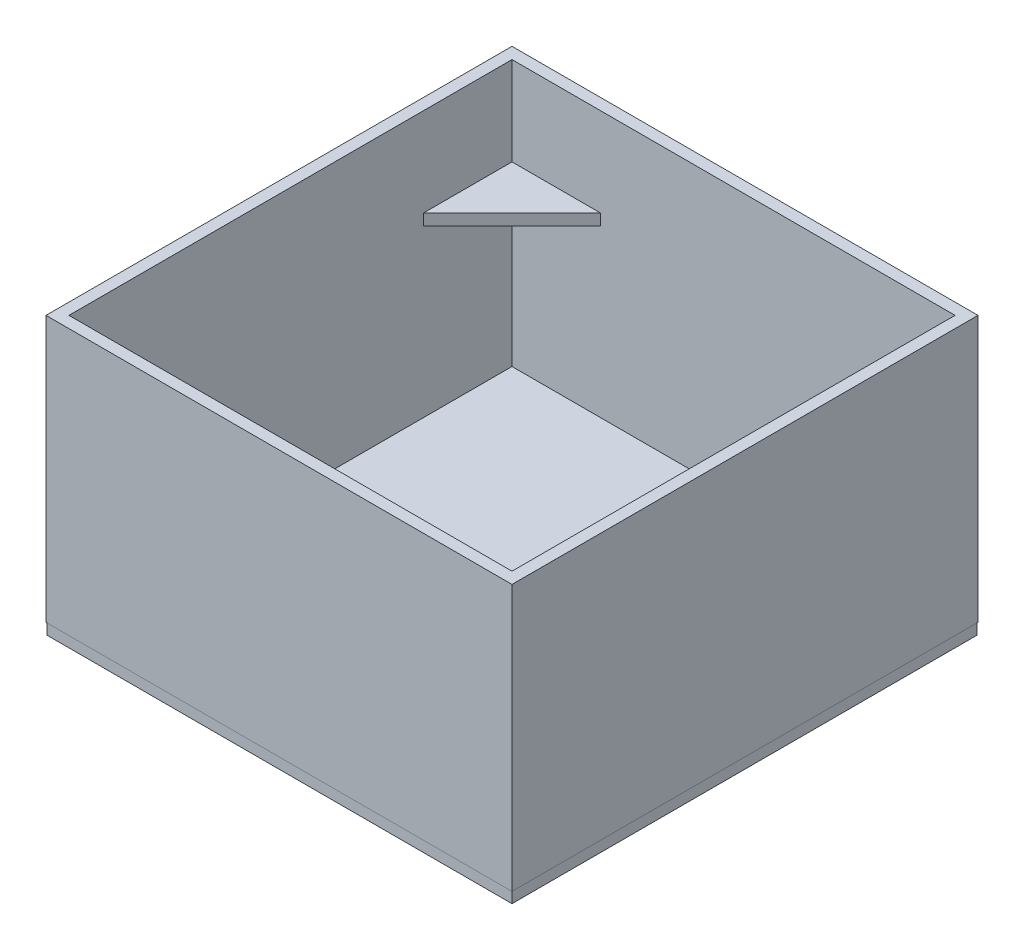
ISO-10303-21;
HEADER;
FILE_DESCRIPTION(('STEP AP214'),'2;1');
FILE_NAME('part.step','',(''),(''),'','','');
FILE_SCHEMA(('AUTOMOTIVE_DESIGN { 1 0 10303 214 1 1 1 1 }'));
ENDSEC;
DATA;
#1=APPLICATION_CONTEXT('core data for automotive mechanical design processes');
#2=APPLICATION_PROTOCOL_DEFINITION('international standard','automotive_design',2000,#1);
#3=PRODUCT_CONTEXT('',#1,'mechanical');
#4=PRODUCT('Part','Part','',(#3));
#5=PRODUCT_RELATED_PRODUCT_CATEGORY('part','',(#4));
#6=PRODUCT_DEFINITION_FORMATION('','',#4);
#7=PRODUCT_DEFINITION_CONTEXT('part definition',#1,'design');
#8=PRODUCT_DEFINITION('design','',#6,#7);
#9=PRODUCT_DEFINITION_SHAPE('','',#8);
#10=(LENGTH_UNIT() NAMED_UNIT(*) SI_UNIT(.MILLI.,.METRE.));
#11=(NAMED_UNIT(*) PLANE_ANGLE_UNIT() SI_UNIT($,.RADIAN.));
#12=(NAMED_UNIT(*) SI_UNIT($,.STERADIAN.) SOLID_ANGLE_UNIT());
#13=UNCERTAINTY_MEASURE_WITH_UNIT(LENGTH_MEASURE(1.E-05),#10,'distance_accuracy_value','');
#14=(GEOMETRIC_REPRESENTATION_CONTEXT(3) GLOBAL_UNCERTAINTY_ASSIGNED_CONTEXT((#13)) GLOBAL_UNIT_ASSIGNED_CONTEXT((#10,
#11,#12)) REPRESENTATION_CONTEXT('',''));
#15=CARTESIAN_POINT('',(0.,0.,0.));
#16=DIRECTION('',(0.,0.,1.));
#17=DIRECTION('',(1.,0.,0.));
#18=AXIS2_PLACEMENT_3D('',#15,#16,#17);
#19=CARTESIAN_POINT('',(52.9092657342657,79.375,-74.0019230769231));
#20=DIRECTION('',(1.,0.,0.));
#21=DIRECTION('',(0.,0.,-1.));
#22=AXIS2_PLACEMENT_3D('',#19,#20,#21);
#23=PLANE('',#22);
#24=DIRECTION('',(0.,0.,-1.));
#25=VECTOR('',#24,1.);
#26=CARTESIAN_POINT('',(52.9092657342657,50.8,52.9980769230769));
#27=LINE('',#26,#25);
#28=CARTESIAN_POINT('',(52.9092657342657,50.8,52.9980769230769));
#29=VERTEX_POINT('',#28);
#30=CARTESIAN_POINT('',(52.9092657342657,50.8,27.5980769230769));
#31=VERTEX_POINT('',#30);
#32=EDGE_CURVE('E219',#29,#31,#27,.T.);
#33=ORIENTED_EDGE('',*,*,#32,.T.);
#34=DIRECTION('',(0.,1.,0.));
#35=VECTOR('',#34,1.);
#36=CARTESIAN_POINT('',(52.9092657342657,50.8,27.5980769230769));
#37=LINE('',#36,#35);
#38=CARTESIAN_POINT('',(52.9092657342657,53.975,27.5980769230769));
#39=VERTEX_POINT('',#38);
#40=EDGE_CURVE('E559',#31,#39,#37,.T.);
#41=ORIENTED_EDGE('',*,*,#40,.T.);
#42=DIRECTION('',(0.,0.,-1.));
#43=VECTOR('',#42,1.);
#44=CARTESIAN_POINT('',(52.9092657342657,53.975,52.9980769230769));
#45=LINE('',#44,#43);
#46=CARTESIAN_POINT('',(52.9092657342657,53.975,52.9980769230769));
#47=VERTEX_POINT('',#46);
#48=EDGE_CURVE('E554',#47,#39,#45,.T.);
#49=ORIENTED_EDGE('',*,*,#48,.F.);
#50=DIRECTION('',(0.,-1.,0.));
#51=VECTOR('',#50,1.);
#52=CARTESIAN_POINT('',(52.9092657342657,79.375,52.9980769230769));
#53=LINE('',#52,#51);
#54=CARTESIAN_POINT('',(52.9092657342657,79.375,52.9980769230769));
#55=VERTEX_POINT('',#54);
#56=EDGE_CURVE('E241',#55,#47,#53,.T.);
#57=ORIENTED_EDGE('',*,*,#56,.F.);
#58=DIRECTION('',(0.,0.,1.));
#59=VECTOR('',#58,1.);
#60=CARTESIAN_POINT('',(52.9092657342657,79.375,-74.0019230769231));
#61=LINE('',#60,#59);
#62=CARTESIAN_POINT('',(52.9092657342657,79.375,-74.0019230769231));
#63=VERTEX_POINT('',#62);
#64=EDGE_CURVE('E568',#63,#55,#61,.T.);
#65=ORIENTED_EDGE('',*,*,#64,.F.);
#66=DIRECTION('',(0.,-1.,0.));
#67=VECTOR('',#66,1.);
#68=CARTESIAN_POINT('',(52.9092657342657,79.375,-74.0019230769231));
#69=LINE('',#68,#67);
#70=CARTESIAN_POINT('',(52.9092657342657,53.975,-74.0019230769231));
#71=VERTEX_POINT('',#70);
#72=EDGE_CURVE('E242',#63,#71,#69,.T.);
#73=ORIENTED_EDGE('',*,*,#72,.T.);
#74=DIRECTION('',(0.,0.,-1.));
#75=VECTOR('',#74,1.);
#76=CARTESIAN_POINT('',(52.9092657342657,53.975,-48.6019230769231));
#77=LINE('',#76,#75);
#78=CARTESIAN_POINT('',(52.9092657342657,53.975,-48.6019230769231));
#79=VERTEX_POINT('',#78);
#80=EDGE_CURVE('E619',#79,#71,#77,.T.);
#81=ORIENTED_EDGE('',*,*,#80,.F.);
#82=DIRECTION('',(0.,1.,0.));
#83=VECTOR('',#82,1.);
#84=CARTESIAN_POINT('',(52.9092657342657,50.8,-48.6019230769231));
#85=LINE('',#84,#83);
#86=CARTESIAN_POINT('',(52.9092657342657,50.8,-48.6019230769231));
#87=VERTEX_POINT('',#86);
#88=EDGE_CURVE('E606',#87,#79,#85,.T.);
#89=ORIENTED_EDGE('',*,*,#88,.F.);
#90=DIRECTION('',(0.,0.,-1.));
#91=VECTOR('',#90,1.);
#92=CARTESIAN_POINT('',(52.9092657342657,50.8,-48.6019230769231));
#93=LINE('',#92,#91);
#94=CARTESIAN_POINT('',(52.9092657342657,50.8,-74.0019230769231));
#95=VERTEX_POINT('',#94);
#96=EDGE_CURVE('E604',#87,#95,#93,.T.);
#97=ORIENTED_EDGE('',*,*,#96,.T.);
#98=CARTESIAN_POINT('',(52.9092657342657,3.175,-74.0019230769231));
#99=VERTEX_POINT('',#98);
#100=EDGE_CURVE('E247',#95,#99,#69,.T.);
#101=ORIENTED_EDGE('',*,*,#100,.T.);
#102=DIRECTION('',(0.,0.,1.));
#103=VECTOR('',#102,1.);
#104=CARTESIAN_POINT('',(52.9092657342657,3.175,-74.0019230769231));
#105=LINE('',#104,#103);
#106=CARTESIAN_POINT('',(52.9092657342657,3.175,52.9980769230769));
#107=VERTEX_POINT('',#106);
#108=EDGE_CURVE('E240',#99,#107,#105,.T.);
#109=ORIENTED_EDGE('',*,*,#108,.T.);
#110=EDGE_CURVE('E233',#29,#107,#53,.T.);
#111=ORIENTED_EDGE('',*,*,#110,.F.);
#112=EDGE_LOOP('',(#33,#41,#49,#57,#65,#73,#81,#89,#97,#101,#109,#111));
#113=FACE_BOUND('',#112,.T.);
#114=ADVANCED_FACE('F57',(#113),#23,.F.);
#115=CARTESIAN_POINT('',(52.9092657342657,79.375,52.9980769230769));
#116=DIRECTION('',(0.,0.,1.));
#117=DIRECTION('',(1.,0.,0.));
#118=AXIS2_PLACEMENT_3D('',#115,#116,#117);
#119=PLANE('',#118);
#120=DIRECTION('',(1.,0.,0.));
#121=VECTOR('',#120,1.);
#122=CARTESIAN_POINT('',(27.5092657342657,50.8,52.9980769230769));
#123=LINE('',#122,#121);
#124=CARTESIAN_POINT('',(27.5092657342657,50.8,52.9980769230769));
#125=VERTEX_POINT('',#124);
#126=EDGE_CURVE('E222',#125,#29,#123,.T.);
#127=ORIENTED_EDGE('',*,*,#126,.T.);
#128=ORIENTED_EDGE('',*,*,#110,.T.);
#129=DIRECTION('',(-1.,0.,0.));
#130=VECTOR('',#129,1.);
#131=CARTESIAN_POINT('',(52.9092657342657,3.175,52.9980769230769));
#132=LINE('',#131,#130);
#133=CARTESIAN_POINT('',(-74.0907342657343,3.175,52.9980769230769));
#134=VERTEX_POINT('',#133);
#135=EDGE_CURVE('E580',#107,#134,#132,.T.);
#136=ORIENTED_EDGE('',*,*,#135,.T.);
#137=DIRECTION('',(0.,-1.,0.));
#138=VECTOR('',#137,1.);
#139=CARTESIAN_POINT('',(-74.0907342657343,79.375,52.9980769230769));
#140=LINE('',#139,#138);
#141=CARTESIAN_POINT('',(-74.0907342657343,50.8,52.9980769230769));
#142=VERTEX_POINT('',#141);
#143=EDGE_CURVE('E245',#142,#134,#140,.T.);
#144=ORIENTED_EDGE('',*,*,#143,.F.);
#145=DIRECTION('',(1.,0.,0.));
#146=VECTOR('',#145,1.);
#147=CARTESIAN_POINT('',(-74.0907342657343,50.8,52.9980769230769));
#148=LINE('',#147,#146);
#149=CARTESIAN_POINT('',(-48.6907342657343,50.8,52.9980769230769));
#150=VERTEX_POINT('',#149);
#151=EDGE_CURVE('E625',#142,#150,#148,.T.);
#152=ORIENTED_EDGE('',*,*,#151,.T.);
#153=DIRECTION('',(0.,1.,0.));
#154=VECTOR('',#153,1.);
#155=CARTESIAN_POINT('',(-48.6907342657343,50.8,52.9980769230769));
#156=LINE('',#155,#154);
#157=CARTESIAN_POINT('',(-48.6907342657343,53.975,52.9980769230769));
#158=VERTEX_POINT('',#157);
#159=EDGE_CURVE('E631',#150,#158,#156,.T.);
#160=ORIENTED_EDGE('',*,*,#159,.T.);
#161=DIRECTION('',(1.,0.,0.));
#162=VECTOR('',#161,1.);
#163=CARTESIAN_POINT('',(-74.0907342657343,53.975,52.9980769230769));
#164=LINE('',#163,#162);
#165=CARTESIAN_POINT('',(-74.0907342657343,53.975,52.9980769230769));
#166=VERTEX_POINT('',#165);
#167=EDGE_CURVE('E623',#166,#158,#164,.T.);
#168=ORIENTED_EDGE('',*,*,#167,.F.);
#169=CARTESIAN_POINT('',(-74.0907342657343,79.375,52.9980769230769));
#170=VERTEX_POINT('',#169);
#171=EDGE_CURVE('E250',#170,#166,#140,.T.);
#172=ORIENTED_EDGE('',*,*,#171,.F.);
#173=DIRECTION('',(-1.,0.,0.));
#174=VECTOR('',#173,1.);
#175=CARTESIAN_POINT('',(52.9092657342657,79.375,52.9980769230769));
#176=LINE('',#175,#174);
#177=EDGE_CURVE('E563',#55,#170,#176,.T.);
#178=ORIENTED_EDGE('',*,*,#177,.F.);
#179=ORIENTED_EDGE('',*,*,#56,.T.);
#180=DIRECTION('',(1.,0.,0.));
#181=VECTOR('',#180,1.);
#182=CARTESIAN_POINT('',(27.5092657342657,53.975,52.9980769230769));
#183=LINE('',#182,#181);
#184=CARTESIAN_POINT('',(27.5092657342657,53.975,52.9980769230769));
#185=VERTEX_POINT('',#184);
#186=EDGE_CURVE('E552',#185,#47,#183,.T.);
#187=ORIENTED_EDGE('',*,*,#186,.F.);
#188=DIRECTION('',(0.,1.,0.));
#189=VECTOR('',#188,1.);
#190=CARTESIAN_POINT('',(27.5092657342657,50.8,52.9980769230769));
#191=LINE('',#190,#189);
#192=EDGE_CURVE('E236',#125,#185,#191,.T.);
#193=ORIENTED_EDGE('',*,*,#192,.F.);
#194=EDGE_LOOP('',(#127,#128,#136,#144,#152,#160,#168,#172,#178,#179,#187,#193));
#195=FACE_BOUND('',#194,.T.);
#196=ADVANCED_FACE('F231',(#195),#119,.F.);
#197=CARTESIAN_POINT('',(-74.0907342657343,79.375,-74.0019230769231));
#198=DIRECTION('',(0.,0.,-1.));
#199=DIRECTION('',(-1.,0.,0.));
#200=AXIS2_PLACEMENT_3D('',#197,#198,#199);
#201=PLANE('',#200);
#202=DIRECTION('',(-1.,0.,0.));
#203=VECTOR('',#202,1.);
#204=CARTESIAN_POINT('',(52.9092657342657,50.8,-74.0019230769231));
#205=LINE('',#204,#203);
#206=CARTESIAN_POINT('',(27.5092657342657,50.8,-74.0019230769231));
#207=VERTEX_POINT('',#206);
#208=EDGE_CURVE('E601',#95,#207,#205,.T.);
#209=ORIENTED_EDGE('',*,*,#208,.T.);
#210=DIRECTION('',(0.,1.,0.));
#211=VECTOR('',#210,1.);
#212=CARTESIAN_POINT('',(27.5092657342657,50.8,-74.0019230769231));
#213=LINE('',#212,#211);
#214=CARTESIAN_POINT('',(27.5092657342657,53.975,-74.0019230769231));
#215=VERTEX_POINT('',#214);
#216=EDGE_CURVE('E618',#207,#215,#213,.T.);
#217=ORIENTED_EDGE('',*,*,#216,.T.);
#218=DIRECTION('',(-1.,0.,0.));
#219=VECTOR('',#218,1.);
#220=CARTESIAN_POINT('',(52.9092657342657,53.975,-74.0019230769231));
#221=LINE('',#220,#219);
#222=EDGE_CURVE('E612',#71,#215,#221,.T.);
#223=ORIENTED_EDGE('',*,*,#222,.F.);
#224=ORIENTED_EDGE('',*,*,#72,.F.);
#225=DIRECTION('',(1.,0.,0.));
#226=VECTOR('',#225,1.);
#227=CARTESIAN_POINT('',(-74.0907342657343,79.375,-74.0019230769231));
#228=LINE('',#227,#226);
#229=CARTESIAN_POINT('',(-74.0907342657343,79.375,-74.0019230769231));
#230=VERTEX_POINT('',#229);
#231=EDGE_CURVE('E571',#230,#63,#228,.T.);
#232=ORIENTED_EDGE('',*,*,#231,.F.);
#233=DIRECTION('',(0.,-1.,0.));
#234=VECTOR('',#233,1.);
#235=CARTESIAN_POINT('',(-74.0907342657343,79.375,-74.0019230769231));
#236=LINE('',#235,#234);
#237=CARTESIAN_POINT('',(-74.0907342657343,53.975,-74.0019230769231));
#238=VERTEX_POINT('',#237);
#239=EDGE_CURVE('E270',#230,#238,#236,.T.);
#240=ORIENTED_EDGE('',*,*,#239,.T.);
#241=DIRECTION('',(-1.,0.,0.));
#242=VECTOR('',#241,1.);
#243=CARTESIAN_POINT('',(-74.0907342657343,53.975,-74.0019230769231));
#244=LINE('',#243,#242);
#245=CARTESIAN_POINT('',(-48.6907342657343,53.975,-74.0019230769231));
#246=VERTEX_POINT('',#245);
#247=EDGE_CURVE('E640',#246,#238,#244,.T.);
#248=ORIENTED_EDGE('',*,*,#247,.F.);
#249=DIRECTION('',(0.,1.,0.));
#250=VECTOR('',#249,1.);
#251=CARTESIAN_POINT('',(-48.6907342657343,50.8,-74.0019230769231));
#252=LINE('',#251,#250);
#253=CARTESIAN_POINT('',(-48.6907342657343,50.8,-74.0019230769231));
#254=VERTEX_POINT('',#253);
#255=EDGE_CURVE('E578',#254,#246,#252,.T.);
#256=ORIENTED_EDGE('',*,*,#255,.F.);
#257=DIRECTION('',(-1.,0.,0.));
#258=VECTOR('',#257,1.);
#259=CARTESIAN_POINT('',(-74.0907342657343,50.8,-74.0019230769231));
#260=LINE('',#259,#258);
#261=CARTESIAN_POINT('',(-74.0907342657343,50.8,-74.0019230769231));
#262=VERTEX_POINT('',#261);
#263=EDGE_CURVE('E643',#254,#262,#260,.T.);
#264=ORIENTED_EDGE('',*,*,#263,.T.);
#265=CARTESIAN_POINT('',(-74.0907342657343,3.175,-74.0019230769231));
#266=VERTEX_POINT('',#265);
#267=EDGE_CURVE('E585',#262,#266,#236,.T.);
#268=ORIENTED_EDGE('',*,*,#267,.T.);
#269=DIRECTION('',(1.,0.,0.));
#270=VECTOR('',#269,1.);
#271=CARTESIAN_POINT('',(-74.0907342657343,3.175,-74.0019230769231));
#272=LINE('',#271,#270);
#273=EDGE_CURVE('E575',#266,#99,#272,.T.);
#274=ORIENTED_EDGE('',*,*,#273,.T.);
#275=ORIENTED_EDGE('',*,*,#100,.F.);
#276=EDGE_LOOP('',(#209,#217,#223,#224,#232,#240,#248,#256,#264,#268,#274,#275));
#277=FACE_BOUND('',#276,.T.);
#278=ADVANCED_FACE('F343',(#277),#201,.F.);
#279=CARTESIAN_POINT('',(-74.0907342657343,79.375,-74.0019230769231));
#280=DIRECTION('',(1.,0.,0.));
#281=DIRECTION('',(0.,0.,-1.));
#282=AXIS2_PLACEMENT_3D('',#279,#280,#281);
#283=PLANE('',#282);
#284=DIRECTION('',(0.,1.,0.));
#285=VECTOR('',#284,1.);
#286=CARTESIAN_POINT('',(-74.0907342657343,50.8,27.5980769230769));
#287=LINE('',#286,#285);
#288=CARTESIAN_POINT('',(-74.0907342657343,50.8,27.5980769230769));
#289=VERTEX_POINT('',#288);
#290=CARTESIAN_POINT('',(-74.0907342657343,53.975,27.5980769230769));
#291=VERTEX_POINT('',#290);
#292=EDGE_CURVE('E638',#289,#291,#287,.T.);
#293=ORIENTED_EDGE('',*,*,#292,.F.);
#294=DIRECTION('',(0.,0.,1.));
#295=VECTOR('',#294,1.);
#296=CARTESIAN_POINT('',(-74.0907342657343,50.8,52.9980769230769));
#297=LINE('',#296,#295);
#298=EDGE_CURVE('E596',#289,#142,#297,.T.);
#299=ORIENTED_EDGE('',*,*,#298,.T.);
#300=ORIENTED_EDGE('',*,*,#143,.T.);
#301=DIRECTION('',(0.,0.,1.));
#302=VECTOR('',#301,1.);
#303=CARTESIAN_POINT('',(-74.0907342657343,3.175,-74.0019230769231));
#304=LINE('',#303,#302);
#305=EDGE_CURVE('E582',#266,#134,#304,.T.);
#306=ORIENTED_EDGE('',*,*,#305,.F.);
#307=ORIENTED_EDGE('',*,*,#267,.F.);
#308=DIRECTION('',(0.,0.,1.));
#309=VECTOR('',#308,1.);
#310=CARTESIAN_POINT('',(-74.0907342657343,50.8,-48.6019230769231));
#311=LINE('',#310,#309);
#312=CARTESIAN_POINT('',(-74.0907342657343,50.8,-48.6019230769231));
#313=VERTEX_POINT('',#312);
#314=EDGE_CURVE('E645',#262,#313,#311,.T.);
#315=ORIENTED_EDGE('',*,*,#314,.T.);
#316=DIRECTION('',(0.,1.,0.));
#317=VECTOR('',#316,1.);
#318=CARTESIAN_POINT('',(-74.0907342657343,50.8,-48.6019230769231));
#319=LINE('',#318,#317);
#320=CARTESIAN_POINT('',(-74.0907342657343,53.975,-48.6019230769231));
#321=VERTEX_POINT('',#320);
#322=EDGE_CURVE('E651',#313,#321,#319,.T.);
#323=ORIENTED_EDGE('',*,*,#322,.T.);
#324=DIRECTION('',(0.,0.,1.));
#325=VECTOR('',#324,1.);
#326=CARTESIAN_POINT('',(-74.0907342657343,53.975,-48.6019230769231));
#327=LINE('',#326,#325);
#328=EDGE_CURVE('E653',#238,#321,#327,.T.);
#329=ORIENTED_EDGE('',*,*,#328,.F.);
#330=ORIENTED_EDGE('',*,*,#239,.F.);
#331=DIRECTION('',(0.,0.,1.));
#332=VECTOR('',#331,1.);
#333=CARTESIAN_POINT('',(-74.0907342657343,79.375,-74.0019230769231));
#334=LINE('',#333,#332);
#335=EDGE_CURVE('E567',#230,#170,#334,.T.);
#336=ORIENTED_EDGE('',*,*,#335,.T.);
#337=ORIENTED_EDGE('',*,*,#171,.T.);
#338=DIRECTION('',(0.,0.,1.));
#339=VECTOR('',#338,1.);
#340=CARTESIAN_POINT('',(-74.0907342657343,53.975,52.9980769230769));
#341=LINE('',#340,#339);
#342=EDGE_CURVE('E628',#291,#166,#341,.T.);
#343=ORIENTED_EDGE('',*,*,#342,.F.);
#344=EDGE_LOOP('',(#293,#299,#300,#306,#307,#315,#323,#329,#330,#336,#337,#343));
#345=FACE_BOUND('',#344,.T.);
#346=ADVANCED_FACE('F349',(#345),#283,.T.);
#347=CARTESIAN_POINT('',(-77.2657342657343,3.175,56.1730769230769));
#348=DIRECTION('',(-1.,0.,0.));
#349=DIRECTION('',(0.,0.,1.));
#350=AXIS2_PLACEMENT_3D('',#347,#348,#349);
#351=PLANE('',#350);
#352=DIRECTION('',(0.,0.,-1.));
#353=VECTOR('',#352,1.);
#354=CARTESIAN_POINT('',(-77.2657342657343,0.,56.1730769230769));
#355=LINE('',#354,#353);
#356=CARTESIAN_POINT('',(-77.2657342657343,0.,56.1730769230769));
#357=VERTEX_POINT('',#356);
#358=CARTESIAN_POINT('',(-77.2657342657343,0.,-77.1769230769231));
#359=VERTEX_POINT('',#358);
#360=EDGE_CURVE('E280',#357,#359,#355,.T.);
#361=ORIENTED_EDGE('',*,*,#360,.F.);
#362=DIRECTION('',(0.,-1.,0.));
#363=VECTOR('',#362,1.);
#364=CARTESIAN_POINT('',(-77.2657342657343,3.175,56.1730769230769));
#365=LINE('',#364,#363);
#366=CARTESIAN_POINT('',(-77.2657342657343,3.175,56.1730769230769));
#367=VERTEX_POINT('',#366);
#368=EDGE_CURVE('E12',#367,#357,#365,.T.);
#369=ORIENTED_EDGE('',*,*,#368,.F.);
#370=DIRECTION('',(0.,0.,-1.));
#371=VECTOR('',#370,1.);
#372=CARTESIAN_POINT('',(-77.2657342657343,3.175,56.1730769230769));
#373=LINE('',#372,#371);
#374=CARTESIAN_POINT('',(-77.2657342657343,3.175,-77.1769230769231));
#375=VERTEX_POINT('',#374);
#376=EDGE_CURVE('E286',#367,#375,#373,.T.);
#377=ORIENTED_EDGE('',*,*,#376,.T.);
#378=DIRECTION('',(0.,-1.,0.));
#379=VECTOR('',#378,1.);
#380=CARTESIAN_POINT('',(-77.2657342657343,3.175,-77.1769230769231));
#381=LINE('',#380,#379);
#382=EDGE_CURVE('E61',#375,#359,#381,.T.);
#383=ORIENTED_EDGE('',*,*,#382,.T.);
#384=EDGE_LOOP('',(#361,#369,#377,#383));
#385=FACE_BOUND('',#384,.T.);
#386=ADVANCED_FACE('F59',(#385),#351,.T.);
#387=CARTESIAN_POINT('',(56.0842657342657,3.175,56.1730769230769));
#388=DIRECTION('',(0.,0.,1.));
#389=DIRECTION('',(1.,0.,0.));
#390=AXIS2_PLACEMENT_3D('',#387,#388,#389);
#391=PLANE('',#390);
#392=DIRECTION('',(-1.,0.,0.));
#393=VECTOR('',#392,1.);
#394=CARTESIAN_POINT('',(56.0842657342657,0.,56.1730769230769));
#395=LINE('',#394,#393);
#396=CARTESIAN_POINT('',(56.0842657342657,0.,56.1730769230769));
#397=VERTEX_POINT('',#396);
#398=EDGE_CURVE('E290',#397,#357,#395,.T.);
#399=ORIENTED_EDGE('',*,*,#398,.F.);
#400=DIRECTION('',(0.,-1.,0.));
#401=VECTOR('',#400,1.);
#402=CARTESIAN_POINT('',(56.0842657342657,3.175,56.1730769230769));
#403=LINE('',#402,#401);
#404=CARTESIAN_POINT('',(56.0842657342657,3.175,56.1730769230769));
#405=VERTEX_POINT('',#404);
#406=EDGE_CURVE('E66',#405,#397,#403,.T.);
#407=ORIENTED_EDGE('',*,*,#406,.F.);
#408=DIRECTION('',(-1.,0.,0.));
#409=VECTOR('',#408,1.);
#410=CARTESIAN_POINT('',(56.0842657342657,3.175,56.1730769230769));
#411=LINE('',#410,#409);
#412=EDGE_CURVE('E296',#405,#367,#411,.T.);
#413=ORIENTED_EDGE('',*,*,#412,.T.);
#414=ORIENTED_EDGE('',*,*,#368,.T.);
#415=EDGE_LOOP('',(#399,#407,#413,#414));
#416=FACE_BOUND('',#415,.T.);
#417=ADVANCED_FACE('F324',(#416),#391,.T.);
#418=CARTESIAN_POINT('',(56.0842657342657,3.175,-77.1769230769231));
#419=DIRECTION('',(1.,0.,0.));
#420=DIRECTION('',(0.,0.,-1.));
#421=AXIS2_PLACEMENT_3D('',#418,#419,#420);
#422=PLANE('',#421);
#423=DIRECTION('',(0.,0.,1.));
#424=VECTOR('',#423,1.);
#425=CARTESIAN_POINT('',(56.0842657342657,0.,-77.1769230769231));
#426=LINE('',#425,#424);
#427=CARTESIAN_POINT('',(56.0842657342657,0.,-77.1769230769231));
#428=VERTEX_POINT('',#427);
#429=EDGE_CURVE('E304',#428,#397,#426,.T.);
#430=ORIENTED_EDGE('',*,*,#429,.F.);
#431=DIRECTION('',(0.,-1.,0.));
#432=VECTOR('',#431,1.);
#433=CARTESIAN_POINT('',(56.0842657342657,3.175,-77.1769230769231));
#434=LINE('',#433,#432);
#435=CARTESIAN_POINT('',(56.0842657342657,3.175,-77.1769230769231));
#436=VERTEX_POINT('',#435);
#437=EDGE_CURVE('E309',#436,#428,#434,.T.);
#438=ORIENTED_EDGE('',*,*,#437,.F.);
#439=DIRECTION('',(0.,0.,1.));
#440=VECTOR('',#439,1.);
#441=CARTESIAN_POINT('',(56.0842657342657,3.175,-77.1769230769231));
#442=LINE('',#441,#440);
#443=EDGE_CURVE('E293',#436,#405,#442,.T.);
#444=ORIENTED_EDGE('',*,*,#443,.T.);
#445=ORIENTED_EDGE('',*,*,#406,.T.);
#446=EDGE_LOOP('',(#430,#438,#444,#445));
#447=FACE_BOUND('',#446,.T.);
#448=ADVANCED_FACE('F329',(#447),#422,.T.);
#449=CARTESIAN_POINT('',(-77.2657342657343,3.175,-77.1769230769231));
#450=DIRECTION('',(0.,0.,-1.));
#451=DIRECTION('',(-1.,0.,0.));
#452=AXIS2_PLACEMENT_3D('',#449,#450,#451);
#453=PLANE('',#452);
#454=DIRECTION('',(1.,0.,0.));
#455=VECTOR('',#454,1.);
#456=CARTESIAN_POINT('',(-77.2657342657343,0.,-77.1769230769231));
#457=LINE('',#456,#455);
#458=EDGE_CURVE('E301',#359,#428,#457,.T.);
#459=ORIENTED_EDGE('',*,*,#458,.F.);
#460=ORIENTED_EDGE('',*,*,#382,.F.);
#461=DIRECTION('',(1.,0.,0.));
#462=VECTOR('',#461,1.);
#463=CARTESIAN_POINT('',(-77.2657342657343,3.175,-77.1769230769231));
#464=LINE('',#463,#462);
#465=EDGE_CURVE('E289',#375,#436,#464,.T.);
#466=ORIENTED_EDGE('',*,*,#465,.T.);
#467=ORIENTED_EDGE('',*,*,#437,.T.);
#468=EDGE_LOOP('',(#459,#460,#466,#467));
#469=FACE_BOUND('',#468,.T.);
#470=ADVANCED_FACE('F318',(#469),#453,.T.);
#471=CARTESIAN_POINT('',(0.,0.,0.));
#472=DIRECTION('',(0.,-1.,0.));
#473=DIRECTION('',(0.,0.,-1.));
#474=AXIS2_PLACEMENT_3D('',#471,#472,#473);
#475=PLANE('',#474);
#476=ORIENTED_EDGE('',*,*,#360,.T.);
#477=ORIENTED_EDGE('',*,*,#458,.T.);
#478=ORIENTED_EDGE('',*,*,#429,.T.);
#479=ORIENTED_EDGE('',*,*,#398,.T.);
#480=EDGE_LOOP('',(#476,#477,#478,#479));
#481=FACE_BOUND('',#480,.T.);
#482=ADVANCED_FACE('F320',(#481),#475,.T.);
#483=CARTESIAN_POINT('',(0.,79.375,-77.2917964572697));
#484=DIRECTION('',(0.,0.,-1.));
#485=DIRECTION('',(-1.,0.,0.));
#486=AXIS2_PLACEMENT_3D('',#483,#484,#485);
#487=PLANE('',#486);
#488=DIRECTION('',(1.,0.,0.));
#489=VECTOR('',#488,1.);
#490=CARTESIAN_POINT('',(0.,3.175,-77.2917964572697));
#491=LINE('',#490,#489);
#492=CARTESIAN_POINT('',(-77.3806076460809,3.175,-77.2917964572697));
#493=VERTEX_POINT('',#492);
#494=CARTESIAN_POINT('',(56.1991391146123,3.175,-77.2917964572697));
#495=VERTEX_POINT('',#494);
#496=EDGE_CURVE('E266',#493,#495,#491,.T.);
#497=ORIENTED_EDGE('',*,*,#496,.F.);
#498=DIRECTION('',(0.,-1.,0.));
#499=VECTOR('',#498,1.);
#500=CARTESIAN_POINT('',(-77.3806076460809,79.375,-77.2917964572697));
#501=LINE('',#500,#499);
#502=CARTESIAN_POINT('',(-77.3806076460809,79.375,-77.2917964572697));
#503=VERTEX_POINT('',#502);
#504=EDGE_CURVE('E278',#503,#493,#501,.T.);
#505=ORIENTED_EDGE('',*,*,#504,.F.);
#506=DIRECTION('',(1.,0.,0.));
#507=VECTOR('',#506,1.);
#508=CARTESIAN_POINT('',(0.,79.375,-77.2917964572697));
#509=LINE('',#508,#507);
#510=CARTESIAN_POINT('',(56.1991391146123,79.375,-77.2917964572697));
#511=VERTEX_POINT('',#510);
#512=EDGE_CURVE('E253',#503,#511,#509,.T.);
#513=ORIENTED_EDGE('',*,*,#512,.T.);
#514=DIRECTION('',(0.,-1.,0.));
#515=VECTOR('',#514,1.);
#516=CARTESIAN_POINT('',(56.1991391146123,79.375,-77.2917964572697));
#517=LINE('',#516,#515);
#518=EDGE_CURVE('E265',#511,#495,#517,.T.);
#519=ORIENTED_EDGE('',*,*,#518,.T.);
#520=EDGE_LOOP('',(#497,#505,#513,#519));
#521=FACE_BOUND('',#520,.T.);
#522=ADVANCED_FACE('F363',(#521),#487,.T.);
#523=CARTESIAN_POINT('',(-77.3806076460809,79.375,0.));
#524=DIRECTION('',(1.,0.,0.));
#525=DIRECTION('',(0.,0.,-1.));
#526=AXIS2_PLACEMENT_3D('',#523,#524,#525);
#527=PLANE('',#526);
#528=DIRECTION('',(0.,0.,1.));
#529=VECTOR('',#528,1.);
#530=CARTESIAN_POINT('',(-77.3806076460809,3.175,0.));
#531=LINE('',#530,#529);
#532=CARTESIAN_POINT('',(-77.3806076460809,3.175,56.2879503034236));
#533=VERTEX_POINT('',#532);
#534=EDGE_CURVE('E257',#493,#533,#531,.T.);
#535=ORIENTED_EDGE('',*,*,#534,.T.);
#536=DIRECTION('',(0.,-1.,0.));
#537=VECTOR('',#536,1.);
#538=CARTESIAN_POINT('',(-77.3806076460809,79.375,56.2879503034236));
#539=LINE('',#538,#537);
#540=CARTESIAN_POINT('',(-77.3806076460809,79.375,56.2879503034236));
#541=VERTEX_POINT('',#540);
#542=EDGE_CURVE('E281',#541,#533,#539,.T.);
#543=ORIENTED_EDGE('',*,*,#542,.F.);
#544=DIRECTION('',(0.,0.,1.));
#545=VECTOR('',#544,1.);
#546=CARTESIAN_POINT('',(-77.3806076460809,79.375,0.));
#547=LINE('',#546,#545);
#548=EDGE_CURVE('E263',#503,#541,#547,.T.);
#549=ORIENTED_EDGE('',*,*,#548,.F.);
#550=ORIENTED_EDGE('',*,*,#504,.T.);
#551=EDGE_LOOP('',(#535,#543,#549,#550));
#552=FACE_BOUND('',#551,.T.);
#553=ADVANCED_FACE('F359',(#552),#527,.F.);
#554=CARTESIAN_POINT('',(0.,79.375,56.2879503034236));
#555=DIRECTION('',(0.,0.,1.));
#556=DIRECTION('',(1.,0.,0.));
#557=AXIS2_PLACEMENT_3D('',#554,#555,#556);
#558=PLANE('',#557);
#559=DIRECTION('',(-1.,0.,0.));
#560=VECTOR('',#559,1.);
#561=CARTESIAN_POINT('',(0.,3.175,56.2879503034236));
#562=LINE('',#561,#560);
#563=CARTESIAN_POINT('',(56.1991391146124,3.175,56.2879503034236));
#564=VERTEX_POINT('',#563);
#565=EDGE_CURVE('E273',#564,#533,#562,.T.);
#566=ORIENTED_EDGE('',*,*,#565,.F.);
#567=DIRECTION('',(0.,-1.,0.));
#568=VECTOR('',#567,1.);
#569=CARTESIAN_POINT('',(56.1991391146124,79.375,56.2879503034236));
#570=LINE('',#569,#568);
#571=CARTESIAN_POINT('',(56.1991391146124,79.375,56.2879503034236));
#572=VERTEX_POINT('',#571);
#573=EDGE_CURVE('E283',#572,#564,#570,.T.);
#574=ORIENTED_EDGE('',*,*,#573,.F.);
#575=DIRECTION('',(-1.,0.,0.));
#576=VECTOR('',#575,1.);
#577=CARTESIAN_POINT('',(0.,79.375,56.2879503034236));
#578=LINE('',#577,#576);
#579=EDGE_CURVE('E260',#572,#541,#578,.T.);
#580=ORIENTED_EDGE('',*,*,#579,.T.);
#581=ORIENTED_EDGE('',*,*,#542,.T.);
#582=EDGE_LOOP('',(#566,#574,#580,#581));
#583=FACE_BOUND('',#582,.T.);
#584=ADVANCED_FACE('F362',(#583),#558,.T.);
#585=CARTESIAN_POINT('',(56.1991391146123,79.375,0.));
#586=DIRECTION('',(1.,0.,0.));
#587=DIRECTION('',(0.,0.,-1.));
#588=AXIS2_PLACEMENT_3D('',#585,#586,#587);
#589=PLANE('',#588);
#590=DIRECTION('',(0.,0.,1.));
#591=VECTOR('',#590,1.);
#592=CARTESIAN_POINT('',(56.1991391146123,3.175,0.));
#593=LINE('',#592,#591);
#594=EDGE_CURVE('E269',#495,#564,#593,.T.);
#595=ORIENTED_EDGE('',*,*,#594,.F.);
#596=ORIENTED_EDGE('',*,*,#518,.F.);
#597=DIRECTION('',(0.,0.,1.));
#598=VECTOR('',#597,1.);
#599=CARTESIAN_POINT('',(56.1991391146123,79.375,0.));
#600=LINE('',#599,#598);
#601=EDGE_CURVE('E256',#511,#572,#600,.T.);
#602=ORIENTED_EDGE('',*,*,#601,.T.);
#603=ORIENTED_EDGE('',*,*,#573,.T.);
#604=EDGE_LOOP('',(#595,#596,#602,#603));
#605=FACE_BOUND('',#604,.T.);
#606=ADVANCED_FACE('F354',(#605),#589,.T.);
#607=CARTESIAN_POINT('',(0.,79.375,0.));
#608=DIRECTION('',(0.,-1.,0.));
#609=DIRECTION('',(0.,0.,-1.));
#610=AXIS2_PLACEMENT_3D('',#607,#608,#609);
#611=PLANE('',#610);
#612=ORIENTED_EDGE('',*,*,#335,.F.);
#613=ORIENTED_EDGE('',*,*,#231,.T.);
#614=ORIENTED_EDGE('',*,*,#64,.T.);
#615=ORIENTED_EDGE('',*,*,#177,.T.);
#616=EDGE_LOOP('',(#612,#613,#614,#615));
#617=FACE_BOUND('',#616,.T.);
#618=ORIENTED_EDGE('',*,*,#512,.F.);
#619=ORIENTED_EDGE('',*,*,#548,.T.);
#620=ORIENTED_EDGE('',*,*,#579,.F.);
#621=ORIENTED_EDGE('',*,*,#601,.F.);
#622=EDGE_LOOP('',(#618,#619,#620,#621));
#623=FACE_BOUND('',#622,.T.);
#624=ADVANCED_FACE('F351',(#617,#623),#611,.F.);
#625=CARTESIAN_POINT('',(0.,3.175,0.));
#626=DIRECTION('',(0.,-1.,0.));
#627=DIRECTION('',(0.,0.,-1.));
#628=AXIS2_PLACEMENT_3D('',#625,#626,#627);
#629=PLANE('',#628);
#630=ORIENTED_EDGE('',*,*,#465,.F.);
#631=ORIENTED_EDGE('',*,*,#376,.F.);
#632=ORIENTED_EDGE('',*,*,#412,.F.);
#633=ORIENTED_EDGE('',*,*,#443,.F.);
#634=EDGE_LOOP('',(#630,#631,#632,#633));
#635=FACE_BOUND('',#634,.T.);
#636=ORIENTED_EDGE('',*,*,#496,.T.);
#637=ORIENTED_EDGE('',*,*,#594,.T.);
#638=ORIENTED_EDGE('',*,*,#565,.T.);
#639=ORIENTED_EDGE('',*,*,#534,.F.);
#640=EDGE_LOOP('',(#636,#637,#638,#639));
#641=FACE_BOUND('',#640,.T.);
#642=ADVANCED_FACE('F326',(#635,#641),#629,.T.);
#643=CARTESIAN_POINT('',(0.,3.175,0.));
#644=DIRECTION('',(0.,-1.,0.));
#645=DIRECTION('',(0.,0.,-1.));
#646=AXIS2_PLACEMENT_3D('',#643,#644,#645);
#647=PLANE('',#646);
#648=ORIENTED_EDGE('',*,*,#273,.F.);
#649=ORIENTED_EDGE('',*,*,#305,.T.);
#650=ORIENTED_EDGE('',*,*,#135,.F.);
#651=ORIENTED_EDGE('',*,*,#108,.F.);
#652=EDGE_LOOP('',(#648,#649,#650,#651));
#653=FACE_BOUND('',#652,.T.);
#654=ADVANCED_FACE('F358',(#653),#647,.F.);
#655=CARTESIAN_POINT('',(-48.6907342657343,50.8,-74.0019230769231));
#656=DIRECTION('',(0.707106781186548,0.,0.707106781186548));
#657=DIRECTION('',(0.707106781186548,0.,-0.707106781186548));
#658=AXIS2_PLACEMENT_3D('',#655,#656,#657);
#659=PLANE('',#658);
#660=DIRECTION('',(0.707106781186547,0.,-0.707106781186547));
#661=VECTOR('',#660,1.);
#662=CARTESIAN_POINT('',(-48.6907342657343,53.975,-74.0019230769231));
#663=LINE('',#662,#661);
#664=EDGE_CURVE('E646',#321,#246,#663,.T.);
#665=ORIENTED_EDGE('',*,*,#664,.F.);
#666=ORIENTED_EDGE('',*,*,#322,.F.);
#667=DIRECTION('',(0.707106781186547,0.,-0.707106781186547));
#668=VECTOR('',#667,1.);
#669=CARTESIAN_POINT('',(-48.6907342657343,50.8,-74.0019230769231));
#670=LINE('',#669,#668);
#671=EDGE_CURVE('E648',#313,#254,#670,.T.);
#672=ORIENTED_EDGE('',*,*,#671,.T.);
#673=ORIENTED_EDGE('',*,*,#255,.T.);
#674=EDGE_LOOP('',(#665,#666,#672,#673));
#675=FACE_BOUND('',#674,.T.);
#676=ADVANCED_FACE('F376',(#675),#659,.T.);
#677=CARTESIAN_POINT('',(0.,50.8,0.));
#678=DIRECTION('',(0.,1.,0.));
#679=DIRECTION('',(0.,0.,1.));
#680=AXIS2_PLACEMENT_3D('',#677,#678,#679);
#681=PLANE('',#680);
#682=ORIENTED_EDGE('',*,*,#263,.F.);
#683=ORIENTED_EDGE('',*,*,#671,.F.);
#684=ORIENTED_EDGE('',*,*,#314,.F.);
#685=EDGE_LOOP('',(#682,#683,#684));
#686=FACE_BOUND('',#685,.T.);
#687=ADVANCED_FACE('F442',(#686),#681,.F.);
#688=CARTESIAN_POINT('',(0.,53.975,0.));
#689=DIRECTION('',(0.,1.,0.));
#690=DIRECTION('',(0.,0.,1.));
#691=AXIS2_PLACEMENT_3D('',#688,#689,#690);
#692=PLANE('',#691);
#693=ORIENTED_EDGE('',*,*,#247,.T.);
#694=ORIENTED_EDGE('',*,*,#328,.T.);
#695=ORIENTED_EDGE('',*,*,#664,.T.);
#696=EDGE_LOOP('',(#693,#694,#695));
#697=FACE_BOUND('',#696,.T.);
#698=ADVANCED_FACE('F449',(#697),#692,.T.);
#699=CARTESIAN_POINT('',(-74.0907342657343,50.8,27.5980769230769));
#700=DIRECTION('',(0.707106781186547,0.,-0.707106781186548));
#701=DIRECTION('',(-0.707106781186548,0.,-0.707106781186547));
#702=AXIS2_PLACEMENT_3D('',#699,#700,#701);
#703=PLANE('',#702);
#704=DIRECTION('',(-0.707106781186548,0.,-0.707106781186547));
#705=VECTOR('',#704,1.);
#706=CARTESIAN_POINT('',(-74.0907342657343,53.975,27.5980769230769));
#707=LINE('',#706,#705);
#708=EDGE_CURVE('E634',#158,#291,#707,.T.);
#709=ORIENTED_EDGE('',*,*,#708,.F.);
#710=ORIENTED_EDGE('',*,*,#159,.F.);
#711=DIRECTION('',(-0.707106781186548,0.,-0.707106781186547));
#712=VECTOR('',#711,1.);
#713=CARTESIAN_POINT('',(-74.0907342657343,50.8,27.5980769230769));
#714=LINE('',#713,#712);
#715=EDGE_CURVE('E627',#150,#289,#714,.T.);
#716=ORIENTED_EDGE('',*,*,#715,.T.);
#717=ORIENTED_EDGE('',*,*,#292,.T.);
#718=EDGE_LOOP('',(#709,#710,#716,#717));
#719=FACE_BOUND('',#718,.T.);
#720=ADVANCED_FACE('F457',(#719),#703,.T.);
#721=CARTESIAN_POINT('',(0.,50.8,0.));
#722=DIRECTION('',(0.,1.,0.));
#723=DIRECTION('',(0.,0.,1.));
#724=AXIS2_PLACEMENT_3D('',#721,#722,#723);
#725=PLANE('',#724);
#726=ORIENTED_EDGE('',*,*,#151,.F.);
#727=ORIENTED_EDGE('',*,*,#298,.F.);
#728=ORIENTED_EDGE('',*,*,#715,.F.);
#729=EDGE_LOOP('',(#726,#727,#728));
#730=FACE_BOUND('',#729,.T.);
#731=ADVANCED_FACE('F465',(#730),#725,.F.);
#732=CARTESIAN_POINT('',(0.,53.975,0.));
#733=DIRECTION('',(0.,1.,0.));
#734=DIRECTION('',(0.,0.,1.));
#735=AXIS2_PLACEMENT_3D('',#732,#733,#734);
#736=PLANE('',#735);
#737=ORIENTED_EDGE('',*,*,#167,.T.);
#738=ORIENTED_EDGE('',*,*,#708,.T.);
#739=ORIENTED_EDGE('',*,*,#342,.T.);
#740=EDGE_LOOP('',(#737,#738,#739));
#741=FACE_BOUND('',#740,.T.);
#742=ADVANCED_FACE('F473',(#741),#736,.T.);
#743=CARTESIAN_POINT('',(27.5092657342657,50.8,-74.0019230769231));
#744=DIRECTION('',(-0.707106781186548,0.,0.707106781186548));
#745=DIRECTION('',(0.707106781186548,0.,0.707106781186548));
#746=AXIS2_PLACEMENT_3D('',#743,#744,#745);
#747=PLANE('',#746);
#748=DIRECTION('',(0.707106781186547,0.,0.707106781186547));
#749=VECTOR('',#748,1.);
#750=CARTESIAN_POINT('',(27.5092657342657,53.975,-74.0019230769231));
#751=LINE('',#750,#749);
#752=EDGE_CURVE('E82',#215,#79,#751,.T.);
#753=ORIENTED_EDGE('',*,*,#752,.F.);
#754=ORIENTED_EDGE('',*,*,#216,.F.);
#755=DIRECTION('',(0.707106781186547,0.,0.707106781186547));
#756=VECTOR('',#755,1.);
#757=CARTESIAN_POINT('',(27.5092657342657,50.8,-74.0019230769231));
#758=LINE('',#757,#756);
#759=EDGE_CURVE('E610',#207,#87,#758,.T.);
#760=ORIENTED_EDGE('',*,*,#759,.T.);
#761=ORIENTED_EDGE('',*,*,#88,.T.);
#762=EDGE_LOOP('',(#753,#754,#760,#761));
#763=FACE_BOUND('',#762,.T.);
#764=ADVANCED_FACE('F481',(#763),#747,.T.);
#765=CARTESIAN_POINT('',(0.,50.8,0.));
#766=DIRECTION('',(0.,1.,0.));
#767=DIRECTION('',(0.,0.,1.));
#768=AXIS2_PLACEMENT_3D('',#765,#766,#767);
#769=PLANE('',#768);
#770=ORIENTED_EDGE('',*,*,#96,.F.);
#771=ORIENTED_EDGE('',*,*,#759,.F.);
#772=ORIENTED_EDGE('',*,*,#208,.F.);
#773=EDGE_LOOP('',(#770,#771,#772));
#774=FACE_BOUND('',#773,.T.);
#775=ADVANCED_FACE('F489',(#774),#769,.F.);
#776=CARTESIAN_POINT('',(0.,53.975,0.));
#777=DIRECTION('',(0.,1.,0.));
#778=DIRECTION('',(0.,0.,1.));
#779=AXIS2_PLACEMENT_3D('',#776,#777,#778);
#780=PLANE('',#779);
#781=ORIENTED_EDGE('',*,*,#80,.T.);
#782=ORIENTED_EDGE('',*,*,#222,.T.);
#783=ORIENTED_EDGE('',*,*,#752,.T.);
#784=EDGE_LOOP('',(#781,#782,#783));
#785=FACE_BOUND('',#784,.T.);
#786=ADVANCED_FACE('F497',(#785),#780,.T.);
#787=CARTESIAN_POINT('',(52.9092657342657,50.8,27.5980769230769));
#788=DIRECTION('',(-0.707106781186548,0.,-0.707106781186548));
#789=DIRECTION('',(-0.707106781186548,0.,0.707106781186548));
#790=AXIS2_PLACEMENT_3D('',#787,#788,#789);
#791=PLANE('',#790);
#792=DIRECTION('',(-0.707106781186547,0.,0.707106781186547));
#793=VECTOR('',#792,1.);
#794=CARTESIAN_POINT('',(52.9092657342657,53.975,27.5980769230769));
#795=LINE('',#794,#793);
#796=EDGE_CURVE('E74',#39,#185,#795,.T.);
#797=ORIENTED_EDGE('',*,*,#796,.F.);
#798=ORIENTED_EDGE('',*,*,#40,.F.);
#799=DIRECTION('',(-0.707106781186547,0.,0.707106781186547));
#800=VECTOR('',#799,1.);
#801=CARTESIAN_POINT('',(52.9092657342657,50.8,27.5980769230769));
#802=LINE('',#801,#800);
#803=EDGE_CURVE('E224',#31,#125,#802,.T.);
#804=ORIENTED_EDGE('',*,*,#803,.T.);
#805=ORIENTED_EDGE('',*,*,#192,.T.);
#806=EDGE_LOOP('',(#797,#798,#804,#805));
#807=FACE_BOUND('',#806,.T.);
#808=ADVANCED_FACE('F505',(#807),#791,.T.);
#809=CARTESIAN_POINT('',(0.,50.8,0.));
#810=DIRECTION('',(0.,1.,0.));
#811=DIRECTION('',(0.,0.,1.));
#812=AXIS2_PLACEMENT_3D('',#809,#810,#811);
#813=PLANE('',#812);
#814=ORIENTED_EDGE('',*,*,#126,.F.);
#815=ORIENTED_EDGE('',*,*,#803,.F.);
#816=ORIENTED_EDGE('',*,*,#32,.F.);
#817=EDGE_LOOP('',(#814,#815,#816));
#818=FACE_BOUND('',#817,.T.);
#819=ADVANCED_FACE('F221',(#818),#813,.F.);
#820=CARTESIAN_POINT('',(0.,53.975,0.));
#821=DIRECTION('',(0.,1.,0.));
#822=DIRECTION('',(0.,0.,1.));
#823=AXIS2_PLACEMENT_3D('',#820,#821,#822);
#824=PLANE('',#823);
#825=ORIENTED_EDGE('',*,*,#186,.T.);
#826=ORIENTED_EDGE('',*,*,#48,.T.);
#827=ORIENTED_EDGE('',*,*,#796,.T.);
#828=EDGE_LOOP('',(#825,#826,#827));
#829=FACE_BOUND('',#828,.T.);
#830=ADVANCED_FACE('F519',(#829),#824,.T.);
#831=CLOSED_SHELL('',(#114,#196,#278,#346,#386,#417,#448,#470,#482,#522,#553,#584,#606,#624,
#642,#654,#676,#687,#698,#720,#731,#742,#764,#775,#786,#808,#819,#830));
#832=MANIFOLD_SOLID_BREP('B2',#831);
#833=ADVANCED_BREP_SHAPE_REPRESENTATION('',(#18,#832),#14);
#834=SHAPE_DEFINITION_REPRESENTATION(#9,#833);
ENDSEC;
END-ISO-10303-21;
